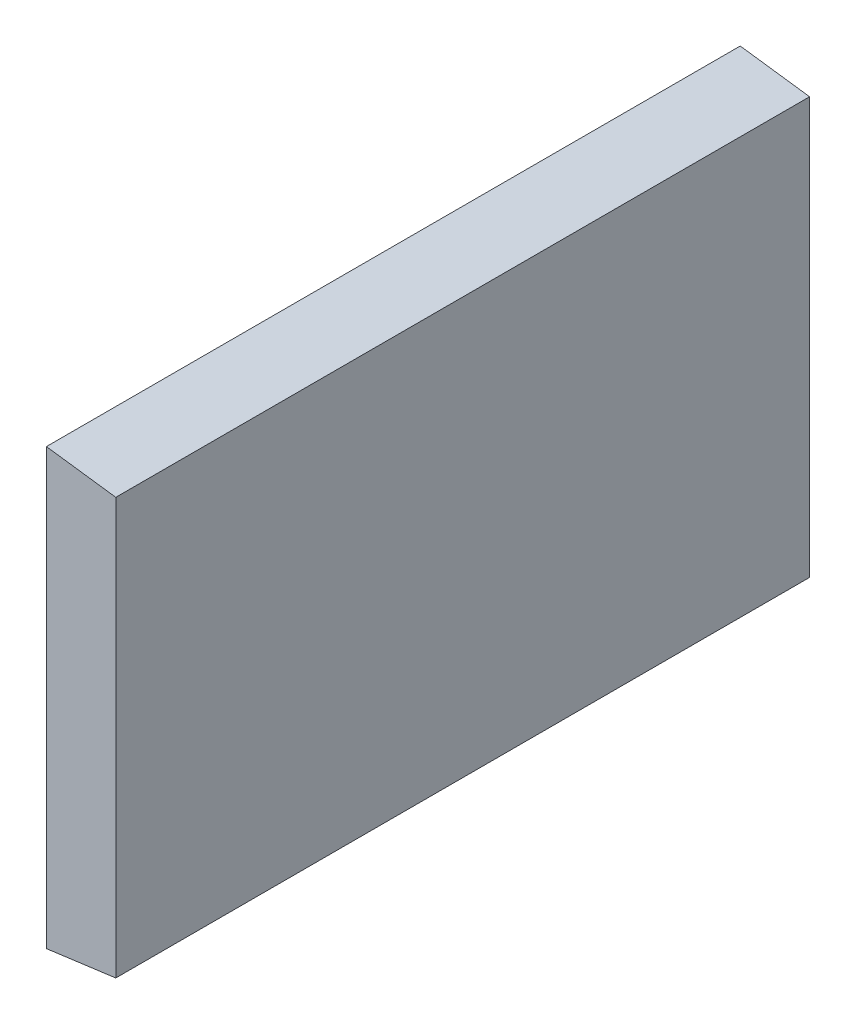
ISO-10303-21;
HEADER;
FILE_DESCRIPTION(('STEP AP214'),'2;1');
FILE_NAME('part.step','',(''),(''),'','','');
FILE_SCHEMA(('AUTOMOTIVE_DESIGN { 1 0 10303 214 1 1 1 1 }'));
ENDSEC;
DATA;
#1=APPLICATION_CONTEXT('core data for automotive mechanical design processes');
#2=APPLICATION_PROTOCOL_DEFINITION('international standard','automotive_design',2000,#1);
#3=PRODUCT_CONTEXT('',#1,'mechanical');
#4=PRODUCT('Part','Part','',(#3));
#5=PRODUCT_RELATED_PRODUCT_CATEGORY('part','',(#4));
#6=PRODUCT_DEFINITION_FORMATION('','',#4);
#7=PRODUCT_DEFINITION_CONTEXT('part definition',#1,'design');
#8=PRODUCT_DEFINITION('design','',#6,#7);
#9=PRODUCT_DEFINITION_SHAPE('','',#8);
#10=(LENGTH_UNIT() NAMED_UNIT(*) SI_UNIT(.MILLI.,.METRE.));
#11=(NAMED_UNIT(*) PLANE_ANGLE_UNIT() SI_UNIT($,.RADIAN.));
#12=(NAMED_UNIT(*) SI_UNIT($,.STERADIAN.) SOLID_ANGLE_UNIT());
#13=UNCERTAINTY_MEASURE_WITH_UNIT(LENGTH_MEASURE(1.E-05),#10,'distance_accuracy_value','');
#14=(GEOMETRIC_REPRESENTATION_CONTEXT(3) GLOBAL_UNCERTAINTY_ASSIGNED_CONTEXT((#13)) GLOBAL_UNIT_ASSIGNED_CONTEXT((#10,
#11,#12)) REPRESENTATION_CONTEXT('',''));
#15=CARTESIAN_POINT('',(0.,0.,0.));
#16=DIRECTION('',(0.,0.,1.));
#17=DIRECTION('',(1.,0.,0.));
#18=AXIS2_PLACEMENT_3D('',#15,#16,#17);
#19=CARTESIAN_POINT('',(10.,-61.3333333333333,100.));
#20=DIRECTION('',(-1.,0.,0.));
#21=DIRECTION('',(0.,0.,1.));
#22=AXIS2_PLACEMENT_3D('',#19,#20,#21);
#23=PLANE('',#22);
#24=DIRECTION('',(0.,1.,0.));
#25=VECTOR('',#24,1.);
#26=CARTESIAN_POINT('',(10.,-61.3333333333333,0.));
#27=LINE('',#26,#25);
#28=CARTESIAN_POINT('',(10.,-61.3333333333333,0.));
#29=VERTEX_POINT('',#28);
#30=CARTESIAN_POINT('',(10.,-1.33333333333334,0.));
#31=VERTEX_POINT('',#30);
#32=EDGE_CURVE('E100',#29,#31,#27,.T.);
#33=ORIENTED_EDGE('',*,*,#32,.T.);
#34=DIRECTION('',(0.,0.,-1.));
#35=VECTOR('',#34,1.);
#36=CARTESIAN_POINT('',(10.,-1.33333333333334,100.));
#37=LINE('',#36,#35);
#38=CARTESIAN_POINT('',(10.,-1.33333333333334,100.));
#39=VERTEX_POINT('',#38);
#40=EDGE_CURVE('E11',#39,#31,#37,.T.);
#41=ORIENTED_EDGE('',*,*,#40,.F.);
#42=DIRECTION('',(0.,1.,0.));
#43=VECTOR('',#42,1.);
#44=CARTESIAN_POINT('',(10.,-61.3333333333333,100.));
#45=LINE('',#44,#43);
#46=CARTESIAN_POINT('',(10.,-61.3333333333333,100.));
#47=VERTEX_POINT('',#46);
#48=EDGE_CURVE('E88',#47,#39,#45,.T.);
#49=ORIENTED_EDGE('',*,*,#48,.F.);
#50=DIRECTION('',(0.,0.,-1.));
#51=VECTOR('',#50,1.);
#52=CARTESIAN_POINT('',(10.,-61.3333333333333,100.));
#53=LINE('',#52,#51);
#54=EDGE_CURVE('E96',#47,#29,#53,.T.);
#55=ORIENTED_EDGE('',*,*,#54,.T.);
#56=EDGE_LOOP('',(#33,#41,#49,#55));
#57=FACE_BOUND('',#56,.T.);
#58=ADVANCED_FACE('F37',(#57),#23,.F.);
#59=CARTESIAN_POINT('',(10.,-1.33333333333334,100.));
#60=DIRECTION('',(-0.132163720091018,-0.991227900682635,0.));
#61=DIRECTION('',(0.991227900682635,-0.132163720091018,0.));
#62=AXIS2_PLACEMENT_3D('',#59,#60,#61);
#63=PLANE('',#62);
#64=DIRECTION('',(-0.991227900682635,0.132163720091018,0.));
#65=VECTOR('',#64,1.);
#66=CARTESIAN_POINT('',(10.,-1.33333333333334,0.));
#67=LINE('',#66,#65);
#68=CARTESIAN_POINT('',(0.,0.,0.));
#69=VERTEX_POINT('',#68);
#70=EDGE_CURVE('E92',#31,#69,#67,.T.);
#71=ORIENTED_EDGE('',*,*,#70,.T.);
#72=DIRECTION('',(0.,0.,-1.));
#73=VECTOR('',#72,1.);
#74=CARTESIAN_POINT('',(0.,0.,100.));
#75=LINE('',#74,#73);
#76=CARTESIAN_POINT('',(0.,0.,100.));
#77=VERTEX_POINT('',#76);
#78=EDGE_CURVE('E45',#77,#69,#75,.T.);
#79=ORIENTED_EDGE('',*,*,#78,.F.);
#80=DIRECTION('',(-0.991227900682635,0.132163720091018,0.));
#81=VECTOR('',#80,1.);
#82=CARTESIAN_POINT('',(10.,-1.33333333333334,100.));
#83=LINE('',#82,#81);
#84=EDGE_CURVE('E83',#39,#77,#83,.T.);
#85=ORIENTED_EDGE('',*,*,#84,.F.);
#86=ORIENTED_EDGE('',*,*,#40,.T.);
#87=EDGE_LOOP('',(#71,#79,#85,#86));
#88=FACE_BOUND('',#87,.T.);
#89=ADVANCED_FACE('F91',(#88),#63,.F.);
#90=CARTESIAN_POINT('',(0.,0.,100.));
#91=DIRECTION('',(1.,0.,0.));
#92=DIRECTION('',(0.,0.,-1.));
#93=AXIS2_PLACEMENT_3D('',#90,#91,#92);
#94=PLANE('',#93);
#95=DIRECTION('',(0.,-1.,0.));
#96=VECTOR('',#95,1.);
#97=CARTESIAN_POINT('',(0.,0.,0.));
#98=LINE('',#97,#96);
#99=CARTESIAN_POINT('',(0.,-62.6666666666667,0.));
#100=VERTEX_POINT('',#99);
#101=EDGE_CURVE('E70',#69,#100,#98,.T.);
#102=ORIENTED_EDGE('',*,*,#101,.T.);
#103=DIRECTION('',(0.,0.,-1.));
#104=VECTOR('',#103,1.);
#105=CARTESIAN_POINT('',(0.,-62.6666666666667,100.));
#106=LINE('',#105,#104);
#107=CARTESIAN_POINT('',(0.,-62.6666666666667,100.));
#108=VERTEX_POINT('',#107);
#109=EDGE_CURVE('E93',#108,#100,#106,.T.);
#110=ORIENTED_EDGE('',*,*,#109,.F.);
#111=DIRECTION('',(0.,-1.,0.));
#112=VECTOR('',#111,1.);
#113=CARTESIAN_POINT('',(0.,0.,100.));
#114=LINE('',#113,#112);
#115=EDGE_CURVE('E86',#77,#108,#114,.T.);
#116=ORIENTED_EDGE('',*,*,#115,.F.);
#117=ORIENTED_EDGE('',*,*,#78,.T.);
#118=EDGE_LOOP('',(#102,#110,#116,#117));
#119=FACE_BOUND('',#118,.T.);
#120=ADVANCED_FACE('F94',(#119),#94,.F.);
#121=CARTESIAN_POINT('',(0.,-62.6666666666667,100.));
#122=DIRECTION('',(-0.132163720091019,0.991227900682635,0.));
#123=DIRECTION('',(-0.991227900682635,-0.132163720091019,0.));
#124=AXIS2_PLACEMENT_3D('',#121,#122,#123);
#125=PLANE('',#124);
#126=DIRECTION('',(0.991227900682635,0.132163720091019,0.));
#127=VECTOR('',#126,1.);
#128=CARTESIAN_POINT('',(0.,-62.6666666666667,0.));
#129=LINE('',#128,#127);
#130=EDGE_CURVE('E76',#100,#29,#129,.T.);
#131=ORIENTED_EDGE('',*,*,#130,.T.);
#132=ORIENTED_EDGE('',*,*,#54,.F.);
#133=DIRECTION('',(0.991227900682635,0.132163720091019,0.));
#134=VECTOR('',#133,1.);
#135=CARTESIAN_POINT('',(0.,-62.6666666666667,100.));
#136=LINE('',#135,#134);
#137=EDGE_CURVE('E53',#108,#47,#136,.T.);
#138=ORIENTED_EDGE('',*,*,#137,.F.);
#139=ORIENTED_EDGE('',*,*,#109,.T.);
#140=EDGE_LOOP('',(#131,#132,#138,#139));
#141=FACE_BOUND('',#140,.T.);
#142=ADVANCED_FACE('F107',(#141),#125,.F.);
#143=CARTESIAN_POINT('',(0.,0.,100.));
#144=DIRECTION('',(0.,0.,1.));
#145=DIRECTION('',(1.,0.,0.));
#146=AXIS2_PLACEMENT_3D('',#143,#144,#145);
#147=PLANE('',#146);
#148=ORIENTED_EDGE('',*,*,#48,.T.);
#149=ORIENTED_EDGE('',*,*,#84,.T.);
#150=ORIENTED_EDGE('',*,*,#115,.T.);
#151=ORIENTED_EDGE('',*,*,#137,.T.);
#152=EDGE_LOOP('',(#148,#149,#150,#151));
#153=FACE_BOUND('',#152,.T.);
#154=ADVANCED_FACE('F84',(#153),#147,.T.);
#155=CARTESIAN_POINT('',(0.,0.,0.));
#156=DIRECTION('',(0.,0.,1.));
#157=DIRECTION('',(1.,0.,0.));
#158=AXIS2_PLACEMENT_3D('',#155,#156,#157);
#159=PLANE('',#158);
#160=ORIENTED_EDGE('',*,*,#32,.F.);
#161=ORIENTED_EDGE('',*,*,#130,.F.);
#162=ORIENTED_EDGE('',*,*,#101,.F.);
#163=ORIENTED_EDGE('',*,*,#70,.F.);
#164=EDGE_LOOP('',(#160,#161,#162,#163));
#165=FACE_BOUND('',#164,.T.);
#166=ADVANCED_FACE('F110',(#165),#159,.F.);
#167=CLOSED_SHELL('',(#58,#89,#120,#142,#154,#166));
#168=MANIFOLD_SOLID_BREP('B2',#167);
#169=ADVANCED_BREP_SHAPE_REPRESENTATION('',(#18,#168),#14);
#170=SHAPE_DEFINITION_REPRESENTATION(#9,#169);
ENDSEC;
END-ISO-10303-21;
